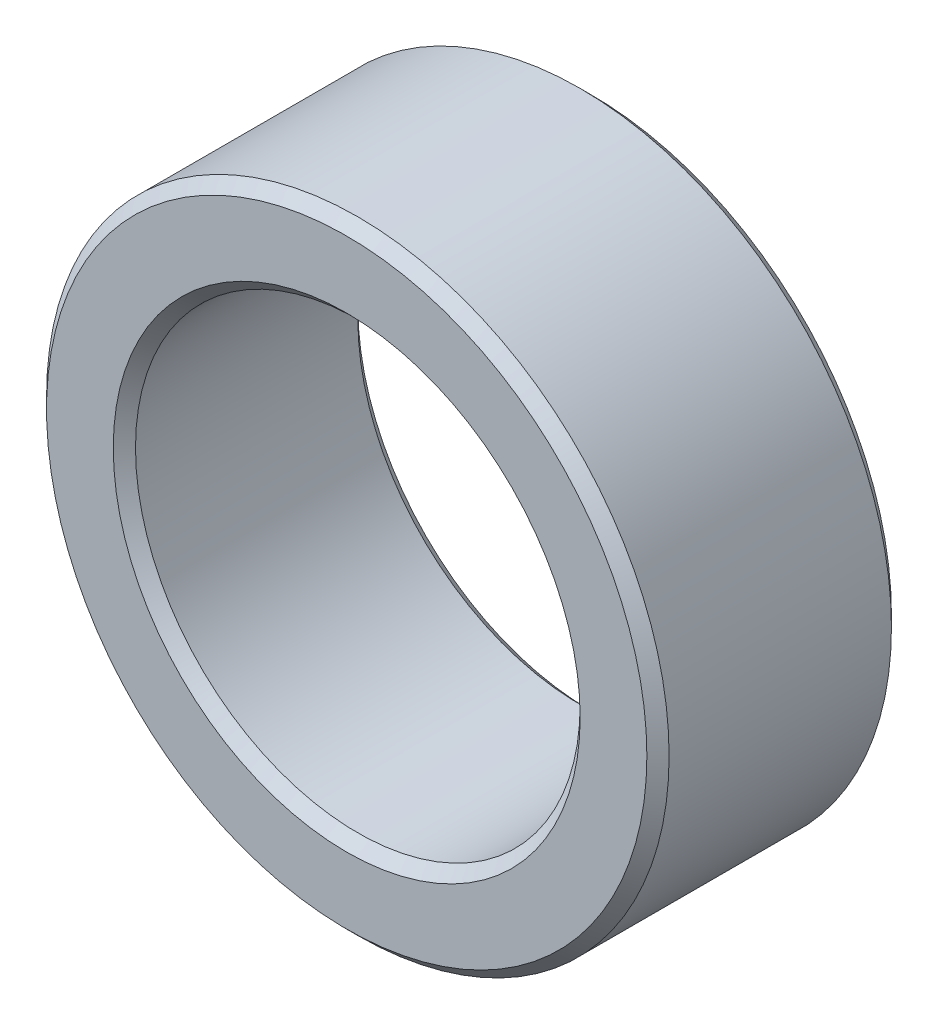
ISO-10303-21;
HEADER;
FILE_DESCRIPTION(('STEP AP214'),'2;1');
FILE_NAME('part.step','',(''),(''),'','','');
FILE_SCHEMA(('AUTOMOTIVE_DESIGN { 1 0 10303 214 1 1 1 1 }'));
ENDSEC;
DATA;
#1=APPLICATION_CONTEXT('core data for automotive mechanical design processes');
#2=APPLICATION_PROTOCOL_DEFINITION('international standard','automotive_design',2000,#1);
#3=PRODUCT_CONTEXT('',#1,'mechanical');
#4=PRODUCT('Part','Part','',(#3));
#5=PRODUCT_RELATED_PRODUCT_CATEGORY('part','',(#4));
#6=PRODUCT_DEFINITION_FORMATION('','',#4);
#7=PRODUCT_DEFINITION_CONTEXT('part definition',#1,'design');
#8=PRODUCT_DEFINITION('design','',#6,#7);
#9=PRODUCT_DEFINITION_SHAPE('','',#8);
#10=(LENGTH_UNIT() NAMED_UNIT(*) SI_UNIT(.MILLI.,.METRE.));
#11=(NAMED_UNIT(*) PLANE_ANGLE_UNIT() SI_UNIT($,.RADIAN.));
#12=(NAMED_UNIT(*) SI_UNIT($,.STERADIAN.) SOLID_ANGLE_UNIT());
#13=UNCERTAINTY_MEASURE_WITH_UNIT(LENGTH_MEASURE(1.E-05),#10,'distance_accuracy_value','');
#14=(GEOMETRIC_REPRESENTATION_CONTEXT(3) GLOBAL_UNCERTAINTY_ASSIGNED_CONTEXT((#13)) GLOBAL_UNIT_ASSIGNED_CONTEXT((#10,
#11,#12)) REPRESENTATION_CONTEXT('',''));
#15=CARTESIAN_POINT('',(0.,0.,0.));
#16=DIRECTION('',(0.,0.,1.));
#17=DIRECTION('',(1.,0.,0.));
#18=AXIS2_PLACEMENT_3D('',#15,#16,#17);
#19=CARTESIAN_POINT('',(0.,0.,5.5));
#20=DIRECTION('',(0.,0.,1.));
#21=DIRECTION('',(1.,0.,0.));
#22=AXIS2_PLACEMENT_3D('',#19,#20,#21);
#23=PLANE('',#22);
#24=CARTESIAN_POINT('',(0.,0.,5.5));
#25=DIRECTION('',(0.,0.,1.));
#26=DIRECTION('',(1.,0.,0.));
#27=AXIS2_PLACEMENT_3D('',#24,#25,#26);
#28=CIRCLE('',#27,5.25);
#29=CARTESIAN_POINT('',(5.25,0.,5.5));
#30=VERTEX_POINT('',#29);
#31=EDGE_CURVE('E10',#30,#30,#28,.F.);
#32=ORIENTED_EDGE('',*,*,#31,.T.);
#33=EDGE_LOOP('',(#32));
#34=FACE_BOUND('',#33,.T.);
#35=CARTESIAN_POINT('',(0.,0.,5.5));
#36=DIRECTION('',(0.,0.,1.));
#37=DIRECTION('',(1.,0.,0.));
#38=AXIS2_PLACEMENT_3D('',#35,#36,#37);
#39=CIRCLE('',#38,6.75);
#40=CARTESIAN_POINT('',(6.75,0.,5.5));
#41=VERTEX_POINT('',#40);
#42=EDGE_CURVE('E37',#41,#41,#39,.T.);
#43=ORIENTED_EDGE('',*,*,#42,.T.);
#44=EDGE_LOOP('',(#43));
#45=FACE_BOUND('',#44,.T.);
#46=ADVANCED_FACE('F30',(#34,#45),#23,.T.);
#47=CARTESIAN_POINT('',(0.,0.,0.));
#48=DIRECTION('',(0.,0.,1.));
#49=DIRECTION('',(1.,0.,0.));
#50=AXIS2_PLACEMENT_3D('',#47,#48,#49);
#51=PLANE('',#50);
#52=CARTESIAN_POINT('',(0.,0.,0.));
#53=DIRECTION('',(0.,0.,1.));
#54=DIRECTION('',(1.,0.,0.));
#55=AXIS2_PLACEMENT_3D('',#52,#53,#54);
#56=CIRCLE('',#55,5.25);
#57=CARTESIAN_POINT('',(5.25,0.,0.));
#58=VERTEX_POINT('',#57);
#59=EDGE_CURVE('E56',#58,#58,#56,.T.);
#60=ORIENTED_EDGE('',*,*,#59,.T.);
#61=EDGE_LOOP('',(#60));
#62=FACE_BOUND('',#61,.T.);
#63=CARTESIAN_POINT('',(0.,0.,0.));
#64=DIRECTION('',(0.,0.,1.));
#65=DIRECTION('',(1.,0.,0.));
#66=AXIS2_PLACEMENT_3D('',#63,#64,#65);
#67=CIRCLE('',#66,6.75);
#68=CARTESIAN_POINT('',(6.75,0.,0.));
#69=VERTEX_POINT('',#68);
#70=EDGE_CURVE('E59',#69,#69,#67,.F.);
#71=ORIENTED_EDGE('',*,*,#70,.T.);
#72=EDGE_LOOP('',(#71));
#73=FACE_BOUND('',#72,.T.);
#74=ADVANCED_FACE('F63',(#62,#73),#51,.F.);
#75=CARTESIAN_POINT('',(0.,0.,5.5));
#76=DIRECTION('',(0.,0.,-1.));
#77=DIRECTION('',(-1.,0.,0.));
#78=AXIS2_PLACEMENT_3D('',#75,#76,#77);
#79=CYLINDRICAL_SURFACE('',#78,7.);
#80=CARTESIAN_POINT('',(0.,0.,0.249999999999999));
#81=DIRECTION('',(0.,0.,1.));
#82=DIRECTION('',(1.,0.,0.));
#83=AXIS2_PLACEMENT_3D('',#80,#81,#82);
#84=CIRCLE('',#83,7.);
#85=CARTESIAN_POINT('',(7.,0.,0.249999999999999));
#86=VERTEX_POINT('',#85);
#87=EDGE_CURVE('E41',#86,#86,#84,.T.);
#88=ORIENTED_EDGE('',*,*,#87,.T.);
#89=EDGE_LOOP('',(#88));
#90=FACE_BOUND('',#89,.T.);
#91=CARTESIAN_POINT('',(0.,0.,5.24999999999999));
#92=DIRECTION('',(0.,0.,1.));
#93=DIRECTION('',(1.,0.,0.));
#94=AXIS2_PLACEMENT_3D('',#91,#92,#93);
#95=CIRCLE('',#94,7.);
#96=CARTESIAN_POINT('',(7.,0.,5.24999999999999));
#97=VERTEX_POINT('',#96);
#98=EDGE_CURVE('E45',#97,#97,#95,.F.);
#99=ORIENTED_EDGE('',*,*,#98,.T.);
#100=EDGE_LOOP('',(#99));
#101=FACE_BOUND('',#100,.T.);
#102=ADVANCED_FACE('F73',(#90,#101),#79,.T.);
#103=CARTESIAN_POINT('',(0.,0.,5.5));
#104=DIRECTION('',(0.,0.,-1.));
#105=DIRECTION('',(-1.,0.,0.));
#106=AXIS2_PLACEMENT_3D('',#103,#104,#105);
#107=CYLINDRICAL_SURFACE('',#106,5.);
#108=CARTESIAN_POINT('',(0.,0.,0.250000000000001));
#109=DIRECTION('',(0.,0.,1.));
#110=DIRECTION('',(1.,0.,0.));
#111=AXIS2_PLACEMENT_3D('',#108,#109,#110);
#112=CIRCLE('',#111,5.);
#113=CARTESIAN_POINT('',(5.,0.,0.250000000000001));
#114=VERTEX_POINT('',#113);
#115=EDGE_CURVE('E50',#114,#114,#112,.F.);
#116=ORIENTED_EDGE('',*,*,#115,.T.);
#117=EDGE_LOOP('',(#116));
#118=FACE_BOUND('',#117,.T.);
#119=CARTESIAN_POINT('',(0.,0.,5.25));
#120=DIRECTION('',(0.,0.,1.));
#121=DIRECTION('',(1.,0.,0.));
#122=AXIS2_PLACEMENT_3D('',#119,#120,#121);
#123=CIRCLE('',#122,5.);
#124=CARTESIAN_POINT('',(5.,0.,5.25));
#125=VERTEX_POINT('',#124);
#126=EDGE_CURVE('E53',#125,#125,#123,.T.);
#127=ORIENTED_EDGE('',*,*,#126,.T.);
#128=EDGE_LOOP('',(#127));
#129=FACE_BOUND('',#128,.T.);
#130=ADVANCED_FACE('F76',(#118,#129),#107,.F.);
#131=CARTESIAN_POINT('',(0.,0.,0.));
#132=DIRECTION('',(0.,0.,-1.));
#133=DIRECTION('',(-1.,0.,0.));
#134=AXIS2_PLACEMENT_3D('',#131,#132,#133);
#135=CONICAL_SURFACE('',#134,5.25,0.785398163397445);
#136=ORIENTED_EDGE('',*,*,#115,.F.);
#137=EDGE_LOOP('',(#136));
#138=FACE_BOUND('',#137,.T.);
#139=ORIENTED_EDGE('',*,*,#59,.F.);
#140=EDGE_LOOP('',(#139));
#141=FACE_BOUND('',#140,.T.);
#142=ADVANCED_FACE('F69',(#138,#141),#135,.F.);
#143=CARTESIAN_POINT('',(0.,0.,0.249999999999999));
#144=DIRECTION('',(0.,0.,1.));
#145=DIRECTION('',(1.,0.,0.));
#146=AXIS2_PLACEMENT_3D('',#143,#144,#145);
#147=CONICAL_SURFACE('',#146,7.,0.78539816339745);
#148=ORIENTED_EDGE('',*,*,#70,.F.);
#149=EDGE_LOOP('',(#148));
#150=FACE_BOUND('',#149,.T.);
#151=ORIENTED_EDGE('',*,*,#87,.F.);
#152=EDGE_LOOP('',(#151));
#153=FACE_BOUND('',#152,.T.);
#154=ADVANCED_FACE('F65',(#150,#153),#147,.T.);
#155=CARTESIAN_POINT('',(0.,0.,5.25));
#156=DIRECTION('',(0.,0.,1.));
#157=DIRECTION('',(1.,0.,0.));
#158=AXIS2_PLACEMENT_3D('',#155,#156,#157);
#159=CONICAL_SURFACE('',#158,5.,0.785398163397452);
#160=ORIENTED_EDGE('',*,*,#31,.F.);
#161=EDGE_LOOP('',(#160));
#162=FACE_BOUND('',#161,.T.);
#163=ORIENTED_EDGE('',*,*,#126,.F.);
#164=EDGE_LOOP('',(#163));
#165=FACE_BOUND('',#164,.T.);
#166=ADVANCED_FACE('F68',(#162,#165),#159,.F.);
#167=CARTESIAN_POINT('',(0.,0.,5.5));
#168=DIRECTION('',(0.,0.,-1.));
#169=DIRECTION('',(-1.,0.,0.));
#170=AXIS2_PLACEMENT_3D('',#167,#168,#169);
#171=CONICAL_SURFACE('',#170,6.75,0.785398163397441);
#172=ORIENTED_EDGE('',*,*,#98,.F.);
#173=EDGE_LOOP('',(#172));
#174=FACE_BOUND('',#173,.T.);
#175=ORIENTED_EDGE('',*,*,#42,.F.);
#176=EDGE_LOOP('',(#175));
#177=FACE_BOUND('',#176,.T.);
#178=ADVANCED_FACE('F32',(#174,#177),#171,.T.);
#179=CLOSED_SHELL('',(#46,#74,#102,#130,#142,#154,#166,#178));
#180=MANIFOLD_SOLID_BREP('B2',#179);
#181=ADVANCED_BREP_SHAPE_REPRESENTATION('',(#18,#180),#14);
#182=SHAPE_DEFINITION_REPRESENTATION(#9,#181);
ENDSEC;
END-ISO-10303-21;
